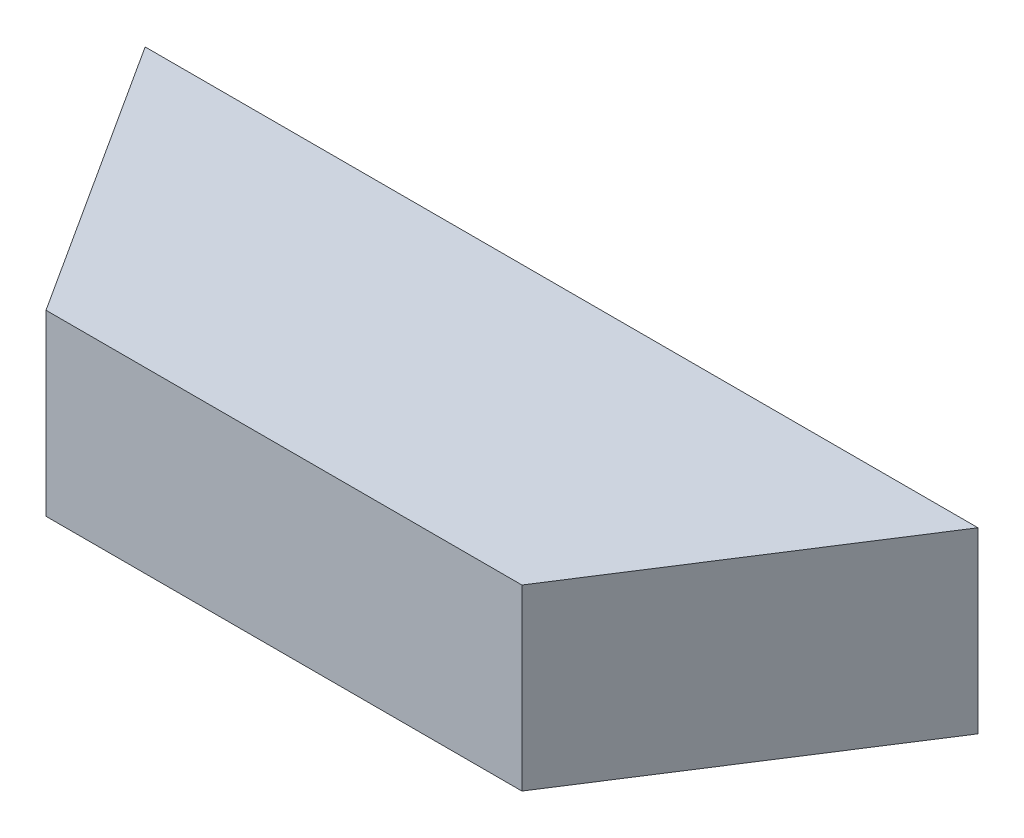
ISO-10303-21;
HEADER;
FILE_DESCRIPTION(('STEP AP214'),'2;1');
FILE_NAME('part.step','',(''),(''),'','','');
FILE_SCHEMA(('AUTOMOTIVE_DESIGN { 1 0 10303 214 1 1 1 1 }'));
ENDSEC;
DATA;
#1=APPLICATION_CONTEXT('core data for automotive mechanical design processes');
#2=APPLICATION_PROTOCOL_DEFINITION('international standard','automotive_design',2000,#1);
#3=PRODUCT_CONTEXT('',#1,'mechanical');
#4=PRODUCT('Part','Part','',(#3));
#5=PRODUCT_RELATED_PRODUCT_CATEGORY('part','',(#4));
#6=PRODUCT_DEFINITION_FORMATION('','',#4);
#7=PRODUCT_DEFINITION_CONTEXT('part definition',#1,'design');
#8=PRODUCT_DEFINITION('design','',#6,#7);
#9=PRODUCT_DEFINITION_SHAPE('','',#8);
#10=(LENGTH_UNIT() NAMED_UNIT(*) SI_UNIT(.MILLI.,.METRE.));
#11=(NAMED_UNIT(*) PLANE_ANGLE_UNIT() SI_UNIT($,.RADIAN.));
#12=(NAMED_UNIT(*) SI_UNIT($,.STERADIAN.) SOLID_ANGLE_UNIT());
#13=UNCERTAINTY_MEASURE_WITH_UNIT(LENGTH_MEASURE(1.E-05),#10,'distance_accuracy_value','');
#14=(GEOMETRIC_REPRESENTATION_CONTEXT(3) GLOBAL_UNCERTAINTY_ASSIGNED_CONTEXT((#13)) GLOBAL_UNIT_ASSIGNED_CONTEXT((#10,
#11,#12)) REPRESENTATION_CONTEXT('',''));
#15=CARTESIAN_POINT('',(0.,0.,0.));
#16=DIRECTION('',(0.,0.,1.));
#17=DIRECTION('',(1.,0.,0.));
#18=AXIS2_PLACEMENT_3D('',#15,#16,#17);
#19=CARTESIAN_POINT('',(-209.55,57.15,-88.9));
#20=DIRECTION('',(0.,0.,1.));
#21=DIRECTION('',(1.,0.,0.));
#22=AXIS2_PLACEMENT_3D('',#19,#20,#21);
#23=PLANE('',#22);
#24=DIRECTION('',(-1.,0.,0.));
#25=VECTOR('',#24,1.);
#26=CARTESIAN_POINT('',(-209.55,0.,-88.9));
#27=LINE('',#26,#25);
#28=CARTESIAN_POINT('',(57.15,0.,-88.9));
#29=VERTEX_POINT('',#28);
#30=CARTESIAN_POINT('',(-209.55,0.,-88.9));
#31=VERTEX_POINT('',#30);
#32=EDGE_CURVE('E155',#29,#31,#27,.T.);
#33=ORIENTED_EDGE('',*,*,#32,.T.);
#34=DIRECTION('',(0.,-1.,0.));
#35=VECTOR('',#34,1.);
#36=CARTESIAN_POINT('',(-209.55,57.15,-88.9));
#37=LINE('',#36,#35);
#38=CARTESIAN_POINT('',(-209.55,57.15,-88.9));
#39=VERTEX_POINT('',#38);
#40=EDGE_CURVE('E40',#39,#31,#37,.T.);
#41=ORIENTED_EDGE('',*,*,#40,.F.);
#42=DIRECTION('',(-1.,0.,0.));
#43=VECTOR('',#42,1.);
#44=CARTESIAN_POINT('',(-209.55,57.15,-88.9));
#45=LINE('',#44,#43);
#46=CARTESIAN_POINT('',(57.15,57.15,-88.9));
#47=VERTEX_POINT('',#46);
#48=EDGE_CURVE('E84',#47,#39,#45,.T.);
#49=ORIENTED_EDGE('',*,*,#48,.F.);
#50=DIRECTION('',(0.,-1.,0.));
#51=VECTOR('',#50,1.);
#52=CARTESIAN_POINT('',(57.15,57.15,-88.9));
#53=LINE('',#52,#51);
#54=EDGE_CURVE('E11',#47,#29,#53,.T.);
#55=ORIENTED_EDGE('',*,*,#54,.T.);
#56=EDGE_LOOP('',(#33,#41,#49,#55));
#57=FACE_BOUND('',#56,.T.);
#58=DIRECTION('',(-1.,0.,0.));
#59=VECTOR('',#58,1.);
#60=CARTESIAN_POINT('',(0.,1.5875,-88.9));
#61=LINE('',#60,#59);
#62=CARTESIAN_POINT('',(55.2627667356332,1.5875,-88.9));
#63=VERTEX_POINT('',#62);
#64=CARTESIAN_POINT('',(-207.662766735633,1.5875,-88.9));
#65=VERTEX_POINT('',#64);
#66=EDGE_CURVE('E128',#63,#65,#61,.T.);
#67=ORIENTED_EDGE('',*,*,#66,.F.);
#68=DIRECTION('',(0.,-1.,0.));
#69=VECTOR('',#68,1.);
#70=CARTESIAN_POINT('',(55.2627667356332,57.15,-88.9));
#71=LINE('',#70,#69);
#72=CARTESIAN_POINT('',(55.2627667356332,55.5625,-88.9));
#73=VERTEX_POINT('',#72);
#74=EDGE_CURVE('E127',#73,#63,#71,.T.);
#75=ORIENTED_EDGE('',*,*,#74,.F.);
#76=DIRECTION('',(-1.,0.,0.));
#77=VECTOR('',#76,1.);
#78=CARTESIAN_POINT('',(0.,55.5625,-88.9));
#79=LINE('',#78,#77);
#80=CARTESIAN_POINT('',(-207.662766735633,55.5625,-88.9));
#81=VERTEX_POINT('',#80);
#82=EDGE_CURVE('E132',#73,#81,#79,.T.);
#83=ORIENTED_EDGE('',*,*,#82,.T.);
#84=DIRECTION('',(0.,-1.,0.));
#85=VECTOR('',#84,1.);
#86=CARTESIAN_POINT('',(-207.662766735633,57.15,-88.8999999999999));
#87=LINE('',#86,#85);
#88=EDGE_CURVE('E137',#81,#65,#87,.T.);
#89=ORIENTED_EDGE('',*,*,#88,.T.);
#90=EDGE_LOOP('',(#67,#75,#83,#89));
#91=FACE_BOUND('',#90,.T.);
#92=ADVANCED_FACE('F32',(#57,#91),#23,.F.);
#93=CARTESIAN_POINT('',(57.15,57.15,-88.9));
#94=DIRECTION('',(-0.841178475376554,0.,-0.540757591313499));
#95=DIRECTION('',(-0.540757591313499,0.,0.841178475376554));
#96=AXIS2_PLACEMENT_3D('',#93,#94,#95);
#97=PLANE('',#96);
#98=DIRECTION('',(0.540757591313499,0.,-0.841178475376554));
#99=VECTOR('',#98,1.);
#100=CARTESIAN_POINT('',(57.15,0.,-88.9));
#101=LINE('',#100,#99);
#102=CARTESIAN_POINT('',(0.,0.,0.));
#103=VERTEX_POINT('',#102);
#104=EDGE_CURVE('E140',#103,#29,#101,.T.);
#105=ORIENTED_EDGE('',*,*,#104,.T.);
#106=ORIENTED_EDGE('',*,*,#54,.F.);
#107=DIRECTION('',(0.540757591313499,0.,-0.841178475376554));
#108=VECTOR('',#107,1.);
#109=CARTESIAN_POINT('',(57.15,57.15,-88.9));
#110=LINE('',#109,#108);
#111=CARTESIAN_POINT('',(0.,57.15,0.));
#112=VERTEX_POINT('',#111);
#113=EDGE_CURVE('E146',#112,#47,#110,.T.);
#114=ORIENTED_EDGE('',*,*,#113,.F.);
#115=DIRECTION('',(0.,-1.,0.));
#116=VECTOR('',#115,1.);
#117=CARTESIAN_POINT('',(0.,57.15,0.));
#118=LINE('',#117,#116);
#119=EDGE_CURVE('E152',#112,#103,#118,.T.);
#120=ORIENTED_EDGE('',*,*,#119,.T.);
#121=EDGE_LOOP('',(#105,#106,#114,#120));
#122=FACE_BOUND('',#121,.T.);
#123=ADVANCED_FACE('F34',(#122),#97,.F.);
#124=CARTESIAN_POINT('',(-152.4,57.15,0.));
#125=DIRECTION('',(0.841178475376554,0.,-0.540757591313499));
#126=DIRECTION('',(-0.540757591313499,0.,-0.841178475376554));
#127=AXIS2_PLACEMENT_3D('',#124,#125,#126);
#128=PLANE('',#127);
#129=DIRECTION('',(0.540757591313499,0.,0.841178475376553));
#130=VECTOR('',#129,1.);
#131=CARTESIAN_POINT('',(-152.4,0.,0.));
#132=LINE('',#131,#130);
#133=CARTESIAN_POINT('',(-152.4,0.,0.));
#134=VERTEX_POINT('',#133);
#135=EDGE_CURVE('E157',#31,#134,#132,.T.);
#136=ORIENTED_EDGE('',*,*,#135,.T.);
#137=DIRECTION('',(0.,-1.,0.));
#138=VECTOR('',#137,1.);
#139=CARTESIAN_POINT('',(-152.4,57.15,0.));
#140=LINE('',#139,#138);
#141=CARTESIAN_POINT('',(-152.4,57.15,0.));
#142=VERTEX_POINT('',#141);
#143=EDGE_CURVE('E161',#142,#134,#140,.T.);
#144=ORIENTED_EDGE('',*,*,#143,.F.);
#145=DIRECTION('',(0.540757591313499,0.,0.841178475376553));
#146=VECTOR('',#145,1.);
#147=CARTESIAN_POINT('',(-152.4,57.15,0.));
#148=LINE('',#147,#146);
#149=EDGE_CURVE('E149',#39,#142,#148,.T.);
#150=ORIENTED_EDGE('',*,*,#149,.F.);
#151=ORIENTED_EDGE('',*,*,#40,.T.);
#152=EDGE_LOOP('',(#136,#144,#150,#151));
#153=FACE_BOUND('',#152,.T.);
#154=ADVANCED_FACE('F166',(#153),#128,.F.);
#155=CARTESIAN_POINT('',(0.,57.15,0.));
#156=DIRECTION('',(0.,0.,-1.));
#157=DIRECTION('',(-1.,0.,0.));
#158=AXIS2_PLACEMENT_3D('',#155,#156,#157);
#159=PLANE('',#158);
#160=DIRECTION('',(1.,0.,0.));
#161=VECTOR('',#160,1.);
#162=CARTESIAN_POINT('',(0.,0.,0.));
#163=LINE('',#162,#161);
#164=EDGE_CURVE('E77',#134,#103,#163,.T.);
#165=ORIENTED_EDGE('',*,*,#164,.T.);
#166=ORIENTED_EDGE('',*,*,#119,.F.);
#167=DIRECTION('',(1.,0.,0.));
#168=VECTOR('',#167,1.);
#169=CARTESIAN_POINT('',(0.,57.15,0.));
#170=LINE('',#169,#168);
#171=EDGE_CURVE('E56',#142,#112,#170,.T.);
#172=ORIENTED_EDGE('',*,*,#171,.F.);
#173=ORIENTED_EDGE('',*,*,#143,.T.);
#174=EDGE_LOOP('',(#165,#166,#172,#173));
#175=FACE_BOUND('',#174,.T.);
#176=ADVANCED_FACE('F174',(#175),#159,.F.);
#177=CARTESIAN_POINT('',(0.,57.15,0.));
#178=DIRECTION('',(0.,-1.,0.));
#179=DIRECTION('',(0.,0.,-1.));
#180=AXIS2_PLACEMENT_3D('',#177,#178,#179);
#181=PLANE('',#180);
#182=ORIENTED_EDGE('',*,*,#113,.T.);
#183=ORIENTED_EDGE('',*,*,#48,.T.);
#184=ORIENTED_EDGE('',*,*,#149,.T.);
#185=ORIENTED_EDGE('',*,*,#171,.T.);
#186=EDGE_LOOP('',(#182,#183,#184,#185));
#187=FACE_BOUND('',#186,.T.);
#188=ADVANCED_FACE('F176',(#187),#181,.F.);
#189=CARTESIAN_POINT('',(0.,0.,0.));
#190=DIRECTION('',(0.,-1.,0.));
#191=DIRECTION('',(0.,0.,-1.));
#192=AXIS2_PLACEMENT_3D('',#189,#190,#191);
#193=PLANE('',#192);
#194=ORIENTED_EDGE('',*,*,#104,.F.);
#195=ORIENTED_EDGE('',*,*,#164,.F.);
#196=ORIENTED_EDGE('',*,*,#135,.F.);
#197=ORIENTED_EDGE('',*,*,#32,.F.);
#198=EDGE_LOOP('',(#194,#195,#196,#197));
#199=FACE_BOUND('',#198,.T.);
#200=ADVANCED_FACE('F170',(#199),#193,.T.);
#201=CARTESIAN_POINT('',(55.8146291703397,57.15,-89.7584526762102));
#202=DIRECTION('',(-0.841178475376554,0.,-0.540757591313499));
#203=DIRECTION('',(-0.540757591313499,0.,0.841178475376554));
#204=AXIS2_PLACEMENT_3D('',#201,#202,#203);
#205=PLANE('',#204);
#206=DIRECTION('',(0.540757591313499,0.,-0.841178475376554));
#207=VECTOR('',#206,1.);
#208=CARTESIAN_POINT('',(-1.33537082966028,1.5875,-0.858452676210178));
#209=LINE('',#208,#207);
#210=CARTESIAN_POINT('',(-0.866697550081106,1.5875,-1.5875));
#211=VERTEX_POINT('',#210);
#212=EDGE_CURVE('E111',#211,#63,#209,.T.);
#213=ORIENTED_EDGE('',*,*,#212,.F.);
#214=DIRECTION('',(0.,-1.,0.));
#215=VECTOR('',#214,1.);
#216=CARTESIAN_POINT('',(-0.866697550081098,57.15,-1.58750000000001));
#217=LINE('',#216,#215);
#218=CARTESIAN_POINT('',(-0.866697550081106,55.5625,-1.5875));
#219=VERTEX_POINT('',#218);
#220=EDGE_CURVE('E119',#219,#211,#217,.T.);
#221=ORIENTED_EDGE('',*,*,#220,.F.);
#222=DIRECTION('',(0.540757591313499,0.,-0.841178475376554));
#223=VECTOR('',#222,1.);
#224=CARTESIAN_POINT('',(-1.33537082966028,55.5625,-0.858452676210178));
#225=LINE('',#224,#223);
#226=EDGE_CURVE('E47',#219,#73,#225,.T.);
#227=ORIENTED_EDGE('',*,*,#226,.T.);
#228=ORIENTED_EDGE('',*,*,#74,.T.);
#229=EDGE_LOOP('',(#213,#221,#227,#228));
#230=FACE_BOUND('',#229,.T.);
#231=ADVANCED_FACE('F125',(#230),#205,.T.);
#232=CARTESIAN_POINT('',(-151.06462917034,57.15,-0.85845267621018));
#233=DIRECTION('',(0.841178475376554,0.,-0.540757591313499));
#234=DIRECTION('',(-0.540757591313499,0.,-0.841178475376554));
#235=AXIS2_PLACEMENT_3D('',#232,#233,#234);
#236=PLANE('',#235);
#237=DIRECTION('',(0.540757591313499,0.,0.841178475376554));
#238=VECTOR('',#237,1.);
#239=CARTESIAN_POINT('',(-106.500008231712,1.5875,68.4642910061003));
#240=LINE('',#239,#238);
#241=CARTESIAN_POINT('',(-151.533302449919,1.5875,-1.5875));
#242=VERTEX_POINT('',#241);
#243=EDGE_CURVE('E114',#65,#242,#240,.T.);
#244=ORIENTED_EDGE('',*,*,#243,.F.);
#245=ORIENTED_EDGE('',*,*,#88,.F.);
#246=DIRECTION('',(0.540757591313499,0.,0.841178475376554));
#247=VECTOR('',#246,1.);
#248=CARTESIAN_POINT('',(-106.500008231712,55.5625,68.4642910061003));
#249=LINE('',#248,#247);
#250=CARTESIAN_POINT('',(-151.533302449919,55.5625,-1.5875));
#251=VERTEX_POINT('',#250);
#252=EDGE_CURVE('E135',#81,#251,#249,.T.);
#253=ORIENTED_EDGE('',*,*,#252,.T.);
#254=DIRECTION('',(0.,-1.,0.));
#255=VECTOR('',#254,1.);
#256=CARTESIAN_POINT('',(-151.533302449919,57.15,-1.5875));
#257=LINE('',#256,#255);
#258=EDGE_CURVE('E123',#251,#242,#257,.T.);
#259=ORIENTED_EDGE('',*,*,#258,.T.);
#260=EDGE_LOOP('',(#244,#245,#253,#259));
#261=FACE_BOUND('',#260,.T.);
#262=ADVANCED_FACE('F191',(#261),#236,.T.);
#263=CARTESIAN_POINT('',(0.,57.15,-1.5875));
#264=DIRECTION('',(0.,0.,-1.));
#265=DIRECTION('',(-1.,0.,0.));
#266=AXIS2_PLACEMENT_3D('',#263,#264,#265);
#267=PLANE('',#266);
#268=DIRECTION('',(1.,0.,0.));
#269=VECTOR('',#268,1.);
#270=CARTESIAN_POINT('',(0.,1.5875,-1.5875));
#271=LINE('',#270,#269);
#272=EDGE_CURVE('E107',#242,#211,#271,.T.);
#273=ORIENTED_EDGE('',*,*,#272,.F.);
#274=ORIENTED_EDGE('',*,*,#258,.F.);
#275=DIRECTION('',(1.,0.,0.));
#276=VECTOR('',#275,1.);
#277=CARTESIAN_POINT('',(0.,55.5625,-1.5875));
#278=LINE('',#277,#276);
#279=EDGE_CURVE('E122',#251,#219,#278,.T.);
#280=ORIENTED_EDGE('',*,*,#279,.T.);
#281=ORIENTED_EDGE('',*,*,#220,.T.);
#282=EDGE_LOOP('',(#273,#274,#280,#281));
#283=FACE_BOUND('',#282,.T.);
#284=ADVANCED_FACE('F120',(#283),#267,.T.);
#285=CARTESIAN_POINT('',(0.,55.5625,0.));
#286=DIRECTION('',(0.,-1.,0.));
#287=DIRECTION('',(0.,0.,-1.));
#288=AXIS2_PLACEMENT_3D('',#285,#286,#287);
#289=PLANE('',#288);
#290=ORIENTED_EDGE('',*,*,#226,.F.);
#291=ORIENTED_EDGE('',*,*,#279,.F.);
#292=ORIENTED_EDGE('',*,*,#252,.F.);
#293=ORIENTED_EDGE('',*,*,#82,.F.);
#294=EDGE_LOOP('',(#290,#291,#292,#293));
#295=FACE_BOUND('',#294,.T.);
#296=ADVANCED_FACE('F194',(#295),#289,.T.);
#297=CARTESIAN_POINT('',(0.,1.5875,0.));
#298=DIRECTION('',(0.,-1.,0.));
#299=DIRECTION('',(0.,0.,-1.));
#300=AXIS2_PLACEMENT_3D('',#297,#298,#299);
#301=PLANE('',#300);
#302=ORIENTED_EDGE('',*,*,#212,.T.);
#303=ORIENTED_EDGE('',*,*,#66,.T.);
#304=ORIENTED_EDGE('',*,*,#243,.T.);
#305=ORIENTED_EDGE('',*,*,#272,.T.);
#306=EDGE_LOOP('',(#302,#303,#304,#305));
#307=FACE_BOUND('',#306,.T.);
#308=ADVANCED_FACE('F109',(#307),#301,.F.);
#309=CLOSED_SHELL('',(#92,#123,#154,#176,#188,#200,#231,#262,#284,#296,#308));
#310=MANIFOLD_SOLID_BREP('B2',#309);
#311=ADVANCED_BREP_SHAPE_REPRESENTATION('',(#18,#310),#14);
#312=SHAPE_DEFINITION_REPRESENTATION(#9,#311);
ENDSEC;
END-ISO-10303-21;
